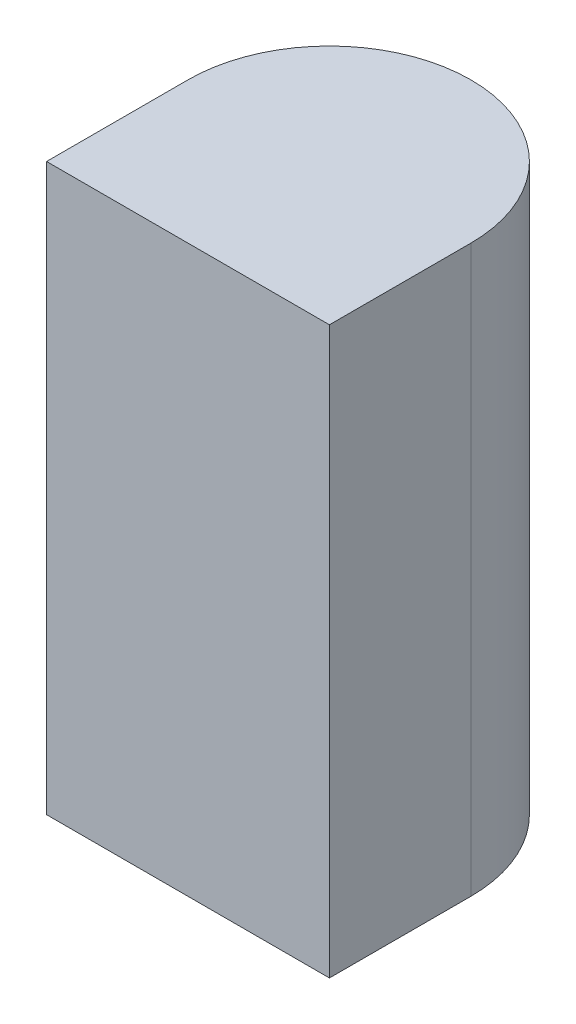
ISO-10303-21;
HEADER;
FILE_DESCRIPTION(('STEP AP214'),'2;1');
FILE_NAME('part.step','',(''),(''),'','','');
FILE_SCHEMA(('AUTOMOTIVE_DESIGN { 1 0 10303 214 1 1 1 1 }'));
ENDSEC;
DATA;
#1=APPLICATION_CONTEXT('core data for automotive mechanical design processes');
#2=APPLICATION_PROTOCOL_DEFINITION('international standard','automotive_design',2000,#1);
#3=PRODUCT_CONTEXT('',#1,'mechanical');
#4=PRODUCT('Part','Part','',(#3));
#5=PRODUCT_RELATED_PRODUCT_CATEGORY('part','',(#4));
#6=PRODUCT_DEFINITION_FORMATION('','',#4);
#7=PRODUCT_DEFINITION_CONTEXT('part definition',#1,'design');
#8=PRODUCT_DEFINITION('design','',#6,#7);
#9=PRODUCT_DEFINITION_SHAPE('','',#8);
#10=(LENGTH_UNIT() NAMED_UNIT(*) SI_UNIT(.MILLI.,.METRE.));
#11=(NAMED_UNIT(*) PLANE_ANGLE_UNIT() SI_UNIT($,.RADIAN.));
#12=(NAMED_UNIT(*) SI_UNIT($,.STERADIAN.) SOLID_ANGLE_UNIT());
#13=UNCERTAINTY_MEASURE_WITH_UNIT(LENGTH_MEASURE(1.E-05),#10,'distance_accuracy_value','');
#14=(GEOMETRIC_REPRESENTATION_CONTEXT(3) GLOBAL_UNCERTAINTY_ASSIGNED_CONTEXT((#13)) GLOBAL_UNIT_ASSIGNED_CONTEXT((#10,
#11,#12)) REPRESENTATION_CONTEXT('',''));
#15=CARTESIAN_POINT('',(0.,0.,0.));
#16=DIRECTION('',(0.,0.,1.));
#17=DIRECTION('',(1.,0.,0.));
#18=AXIS2_PLACEMENT_3D('',#15,#16,#17);
#19=CARTESIAN_POINT('',(-5.,20.,10.));
#20=DIRECTION('',(1.,0.,0.));
#21=DIRECTION('',(0.,0.,-1.));
#22=AXIS2_PLACEMENT_3D('',#19,#20,#21);
#23=PLANE('',#22);
#24=DIRECTION('',(0.,0.,1.));
#25=VECTOR('',#24,1.);
#26=CARTESIAN_POINT('',(-5.,0.,10.));
#27=LINE('',#26,#25);
#28=CARTESIAN_POINT('',(-5.,0.,5.));
#29=VERTEX_POINT('',#28);
#30=CARTESIAN_POINT('',(-5.,0.,10.));
#31=VERTEX_POINT('',#30);
#32=EDGE_CURVE('E100',#29,#31,#27,.T.);
#33=ORIENTED_EDGE('',*,*,#32,.T.);
#34=DIRECTION('',(0.,-1.,0.));
#35=VECTOR('',#34,1.);
#36=CARTESIAN_POINT('',(-5.,20.,10.));
#37=LINE('',#36,#35);
#38=CARTESIAN_POINT('',(-5.,20.,10.));
#39=VERTEX_POINT('',#38);
#40=EDGE_CURVE('E11',#39,#31,#37,.T.);
#41=ORIENTED_EDGE('',*,*,#40,.F.);
#42=DIRECTION('',(0.,0.,1.));
#43=VECTOR('',#42,1.);
#44=CARTESIAN_POINT('',(-5.,20.,10.));
#45=LINE('',#44,#43);
#46=CARTESIAN_POINT('',(-5.,20.,5.));
#47=VERTEX_POINT('',#46);
#48=EDGE_CURVE('E88',#47,#39,#45,.T.);
#49=ORIENTED_EDGE('',*,*,#48,.F.);
#50=DIRECTION('',(0.,-1.,0.));
#51=VECTOR('',#50,1.);
#52=CARTESIAN_POINT('',(-5.,20.,5.));
#53=LINE('',#52,#51);
#54=EDGE_CURVE('E96',#47,#29,#53,.T.);
#55=ORIENTED_EDGE('',*,*,#54,.T.);
#56=EDGE_LOOP('',(#33,#41,#49,#55));
#57=FACE_BOUND('',#56,.T.);
#58=ADVANCED_FACE('F37',(#57),#23,.F.);
#59=CARTESIAN_POINT('',(-5.,20.,10.));
#60=DIRECTION('',(0.,0.,-1.));
#61=DIRECTION('',(-1.,0.,0.));
#62=AXIS2_PLACEMENT_3D('',#59,#60,#61);
#63=PLANE('',#62);
#64=DIRECTION('',(1.,0.,0.));
#65=VECTOR('',#64,1.);
#66=CARTESIAN_POINT('',(-5.,0.,10.));
#67=LINE('',#66,#65);
#68=CARTESIAN_POINT('',(5.,0.,10.));
#69=VERTEX_POINT('',#68);
#70=EDGE_CURVE('E92',#31,#69,#67,.T.);
#71=ORIENTED_EDGE('',*,*,#70,.T.);
#72=DIRECTION('',(0.,-1.,0.));
#73=VECTOR('',#72,1.);
#74=CARTESIAN_POINT('',(5.,20.,10.));
#75=LINE('',#74,#73);
#76=CARTESIAN_POINT('',(5.,20.,10.));
#77=VERTEX_POINT('',#76);
#78=EDGE_CURVE('E45',#77,#69,#75,.T.);
#79=ORIENTED_EDGE('',*,*,#78,.F.);
#80=DIRECTION('',(1.,0.,0.));
#81=VECTOR('',#80,1.);
#82=CARTESIAN_POINT('',(-5.,20.,10.));
#83=LINE('',#82,#81);
#84=EDGE_CURVE('E83',#39,#77,#83,.T.);
#85=ORIENTED_EDGE('',*,*,#84,.F.);
#86=ORIENTED_EDGE('',*,*,#40,.T.);
#87=EDGE_LOOP('',(#71,#79,#85,#86));
#88=FACE_BOUND('',#87,.T.);
#89=ADVANCED_FACE('F91',(#88),#63,.F.);
#90=CARTESIAN_POINT('',(5.,20.,10.));
#91=DIRECTION('',(-1.,0.,0.));
#92=DIRECTION('',(0.,0.,1.));
#93=AXIS2_PLACEMENT_3D('',#90,#91,#92);
#94=PLANE('',#93);
#95=DIRECTION('',(0.,0.,-1.));
#96=VECTOR('',#95,1.);
#97=CARTESIAN_POINT('',(5.,0.,10.));
#98=LINE('',#97,#96);
#99=CARTESIAN_POINT('',(5.,0.,5.));
#100=VERTEX_POINT('',#99);
#101=EDGE_CURVE('E70',#69,#100,#98,.T.);
#102=ORIENTED_EDGE('',*,*,#101,.T.);
#103=DIRECTION('',(0.,-1.,0.));
#104=VECTOR('',#103,1.);
#105=CARTESIAN_POINT('',(5.,20.,5.));
#106=LINE('',#105,#104);
#107=CARTESIAN_POINT('',(5.,20.,5.));
#108=VERTEX_POINT('',#107);
#109=EDGE_CURVE('E93',#108,#100,#106,.T.);
#110=ORIENTED_EDGE('',*,*,#109,.F.);
#111=DIRECTION('',(0.,0.,-1.));
#112=VECTOR('',#111,1.);
#113=CARTESIAN_POINT('',(5.,20.,10.));
#114=LINE('',#113,#112);
#115=EDGE_CURVE('E86',#77,#108,#114,.T.);
#116=ORIENTED_EDGE('',*,*,#115,.F.);
#117=ORIENTED_EDGE('',*,*,#78,.T.);
#118=EDGE_LOOP('',(#102,#110,#116,#117));
#119=FACE_BOUND('',#118,.T.);
#120=ADVANCED_FACE('F94',(#119),#94,.F.);
#121=CARTESIAN_POINT('',(0.,20.,5.));
#122=DIRECTION('',(0.,-1.,0.));
#123=DIRECTION('',(0.,0.,-1.));
#124=AXIS2_PLACEMENT_3D('',#121,#122,#123);
#125=CYLINDRICAL_SURFACE('',#124,5.);
#126=CARTESIAN_POINT('',(0.,0.,5.));
#127=DIRECTION('',(0.,1.,0.));
#128=DIRECTION('',(0.,0.,-1.));
#129=AXIS2_PLACEMENT_3D('',#126,#127,#128);
#130=CIRCLE('',#129,5.);
#131=EDGE_CURVE('E76',#100,#29,#130,.T.);
#132=ORIENTED_EDGE('',*,*,#131,.T.);
#133=ORIENTED_EDGE('',*,*,#54,.F.);
#134=CARTESIAN_POINT('',(0.,20.,5.));
#135=DIRECTION('',(0.,1.,0.));
#136=DIRECTION('',(0.,0.,-1.));
#137=AXIS2_PLACEMENT_3D('',#134,#135,#136);
#138=CIRCLE('',#137,5.);
#139=EDGE_CURVE('E53',#108,#47,#138,.T.);
#140=ORIENTED_EDGE('',*,*,#139,.F.);
#141=ORIENTED_EDGE('',*,*,#109,.T.);
#142=EDGE_LOOP('',(#132,#133,#140,#141));
#143=FACE_BOUND('',#142,.T.);
#144=ADVANCED_FACE('F107',(#143),#125,.T.);
#145=CARTESIAN_POINT('',(0.,20.,5.));
#146=DIRECTION('',(0.,-1.,0.));
#147=DIRECTION('',(0.,0.,-1.));
#148=AXIS2_PLACEMENT_3D('',#145,#146,#147);
#149=PLANE('',#148);
#150=ORIENTED_EDGE('',*,*,#48,.T.);
#151=ORIENTED_EDGE('',*,*,#84,.T.);
#152=ORIENTED_EDGE('',*,*,#115,.T.);
#153=ORIENTED_EDGE('',*,*,#139,.T.);
#154=EDGE_LOOP('',(#150,#151,#152,#153));
#155=FACE_BOUND('',#154,.T.);
#156=ADVANCED_FACE('F84',(#155),#149,.F.);
#157=CARTESIAN_POINT('',(0.,0.,5.));
#158=DIRECTION('',(0.,-1.,0.));
#159=DIRECTION('',(0.,0.,-1.));
#160=AXIS2_PLACEMENT_3D('',#157,#158,#159);
#161=PLANE('',#160);
#162=ORIENTED_EDGE('',*,*,#32,.F.);
#163=ORIENTED_EDGE('',*,*,#131,.F.);
#164=ORIENTED_EDGE('',*,*,#101,.F.);
#165=ORIENTED_EDGE('',*,*,#70,.F.);
#166=EDGE_LOOP('',(#162,#163,#164,#165));
#167=FACE_BOUND('',#166,.T.);
#168=ADVANCED_FACE('F110',(#167),#161,.T.);
#169=CLOSED_SHELL('',(#58,#89,#120,#144,#156,#168));
#170=MANIFOLD_SOLID_BREP('B2',#169);
#171=ADVANCED_BREP_SHAPE_REPRESENTATION('',(#18,#170),#14);
#172=SHAPE_DEFINITION_REPRESENTATION(#9,#171);
ENDSEC;
END-ISO-10303-21;
